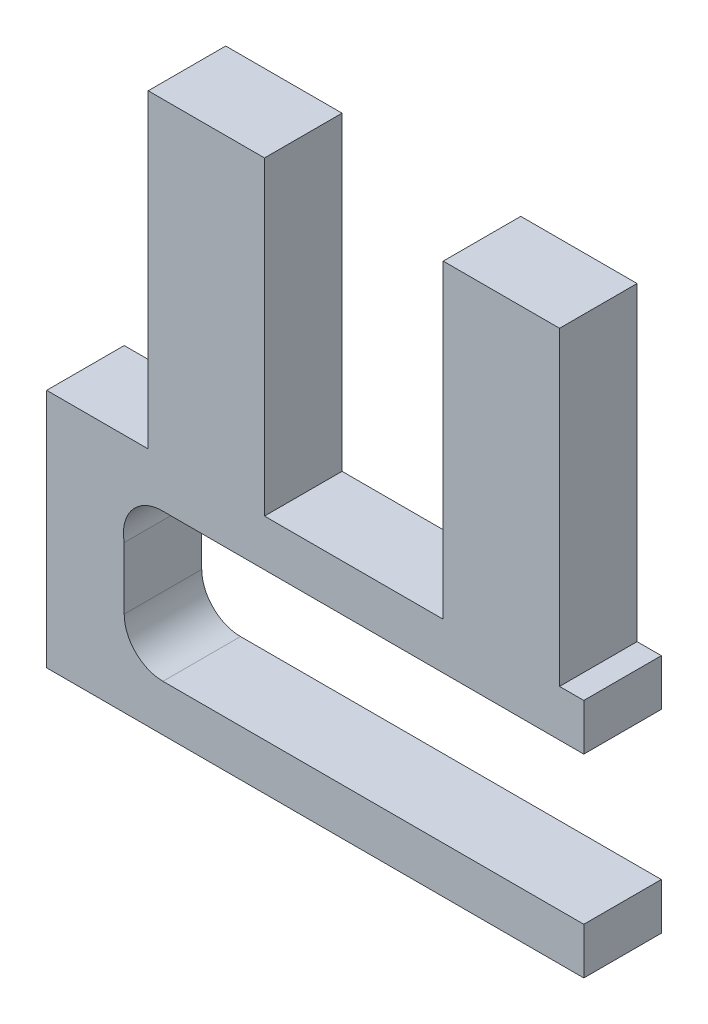
ISO-10303-21;
HEADER;
FILE_DESCRIPTION(('STEP AP214'),'2;1');
FILE_NAME('part.step','',(''),(''),'','','');
FILE_SCHEMA(('AUTOMOTIVE_DESIGN { 1 0 10303 214 1 1 1 1 }'));
ENDSEC;
DATA;
#1=APPLICATION_CONTEXT('core data for automotive mechanical design processes');
#2=APPLICATION_PROTOCOL_DEFINITION('international standard','automotive_design',2000,#1);
#3=PRODUCT_CONTEXT('',#1,'mechanical');
#4=PRODUCT('Part','Part','',(#3));
#5=PRODUCT_RELATED_PRODUCT_CATEGORY('part','',(#4));
#6=PRODUCT_DEFINITION_FORMATION('','',#4);
#7=PRODUCT_DEFINITION_CONTEXT('part definition',#1,'design');
#8=PRODUCT_DEFINITION('design','',#6,#7);
#9=PRODUCT_DEFINITION_SHAPE('','',#8);
#10=(LENGTH_UNIT() NAMED_UNIT(*) SI_UNIT(.MILLI.,.METRE.));
#11=(NAMED_UNIT(*) PLANE_ANGLE_UNIT() SI_UNIT($,.RADIAN.));
#12=(NAMED_UNIT(*) SI_UNIT($,.STERADIAN.) SOLID_ANGLE_UNIT());
#13=UNCERTAINTY_MEASURE_WITH_UNIT(LENGTH_MEASURE(1.E-05),#10,'distance_accuracy_value','');
#14=(GEOMETRIC_REPRESENTATION_CONTEXT(3) GLOBAL_UNCERTAINTY_ASSIGNED_CONTEXT((#13)) GLOBAL_UNIT_ASSIGNED_CONTEXT((#10,
#11,#12)) REPRESENTATION_CONTEXT('',''));
#15=CARTESIAN_POINT('',(0.,0.,0.));
#16=DIRECTION('',(0.,0.,1.));
#17=DIRECTION('',(1.,0.,0.));
#18=AXIS2_PLACEMENT_3D('',#15,#16,#17);
#19=CARTESIAN_POINT('',(0.,7.41885137661942,10.));
#20=DIRECTION('',(0.,1.,0.));
#21=DIRECTION('',(0.,0.,1.));
#22=AXIS2_PLACEMENT_3D('',#19,#20,#21);
#23=PLANE('',#22);
#24=DIRECTION('',(1.,0.,0.));
#25=VECTOR('',#24,1.);
#26=CARTESIAN_POINT('',(0.,7.41885137661942,0.));
#27=LINE('',#26,#25);
#28=CARTESIAN_POINT('',(7.45996937927725,7.41885137661942,0.));
#29=VERTEX_POINT('',#28);
#30=CARTESIAN_POINT('',(61.7300558201244,7.41885137661942,0.));
#31=VERTEX_POINT('',#30);
#32=EDGE_CURVE('E189',#29,#31,#27,.T.);
#33=ORIENTED_EDGE('',*,*,#32,.F.);
#34=DIRECTION('',(0.,0.,-1.));
#35=VECTOR('',#34,1.);
#36=CARTESIAN_POINT('',(7.45996937927725,7.41885137661942,10.));
#37=LINE('',#36,#35);
#38=CARTESIAN_POINT('',(7.45996937927725,7.41885137661942,10.));
#39=VERTEX_POINT('',#38);
#40=EDGE_CURVE('E11',#39,#29,#37,.T.);
#41=ORIENTED_EDGE('',*,*,#40,.F.);
#42=DIRECTION('',(1.,0.,0.));
#43=VECTOR('',#42,1.);
#44=CARTESIAN_POINT('',(0.,7.41885137661942,10.));
#45=LINE('',#44,#43);
#46=CARTESIAN_POINT('',(61.7300558201244,7.41885137661942,10.));
#47=VERTEX_POINT('',#46);
#48=EDGE_CURVE('E237',#39,#47,#45,.T.);
#49=ORIENTED_EDGE('',*,*,#48,.T.);
#50=DIRECTION('',(0.,0.,-1.));
#51=VECTOR('',#50,1.);
#52=CARTESIAN_POINT('',(61.7300558201244,7.41885137661942,10.));
#53=LINE('',#52,#51);
#54=EDGE_CURVE('E49',#47,#31,#53,.T.);
#55=ORIENTED_EDGE('',*,*,#54,.T.);
#56=EDGE_LOOP('',(#33,#41,#49,#55));
#57=FACE_BOUND('',#56,.T.);
#58=ADVANCED_FACE('F33',(#57),#23,.T.);
#59=CARTESIAN_POINT('',(7.45996937927725,12.4188513766194,10.));
#60=DIRECTION('',(0.,0.,-1.));
#61=DIRECTION('',(-1.,0.,0.));
#62=AXIS2_PLACEMENT_3D('',#59,#60,#61);
#63=CYLINDRICAL_SURFACE('',#62,5.);
#64=CARTESIAN_POINT('',(7.45996937927725,12.4188513766194,0.));
#65=DIRECTION('',(0.,0.,1.));
#66=DIRECTION('',(1.,0.,0.));
#67=AXIS2_PLACEMENT_3D('',#64,#65,#66);
#68=CIRCLE('',#67,5.);
#69=CARTESIAN_POINT('',(2.45996937927725,12.4188513766194,0.));
#70=VERTEX_POINT('',#69);
#71=EDGE_CURVE('E191',#29,#70,#68,.F.);
#72=ORIENTED_EDGE('',*,*,#71,.T.);
#73=DIRECTION('',(0.,0.,-1.));
#74=VECTOR('',#73,1.);
#75=CARTESIAN_POINT('',(2.45996937927725,12.4188513766194,10.));
#76=LINE('',#75,#74);
#77=CARTESIAN_POINT('',(2.45996937927725,12.4188513766194,10.));
#78=VERTEX_POINT('',#77);
#79=EDGE_CURVE('E41',#78,#70,#76,.T.);
#80=ORIENTED_EDGE('',*,*,#79,.F.);
#81=CARTESIAN_POINT('',(7.45996937927725,12.4188513766194,10.));
#82=DIRECTION('',(0.,0.,1.));
#83=DIRECTION('',(1.,0.,0.));
#84=AXIS2_PLACEMENT_3D('',#81,#82,#83);
#85=CIRCLE('',#84,5.);
#86=EDGE_CURVE('E286',#39,#78,#85,.F.);
#87=ORIENTED_EDGE('',*,*,#86,.F.);
#88=ORIENTED_EDGE('',*,*,#40,.T.);
#89=EDGE_LOOP('',(#72,#80,#87,#88));
#90=FACE_BOUND('',#89,.T.);
#91=ADVANCED_FACE('F275',(#90),#63,.F.);
#92=CARTESIAN_POINT('',(2.45996937927725,0.,10.));
#93=DIRECTION('',(1.,0.,0.));
#94=DIRECTION('',(0.,0.,-1.));
#95=AXIS2_PLACEMENT_3D('',#92,#93,#94);
#96=PLANE('',#95);
#97=DIRECTION('',(0.,-1.,0.));
#98=VECTOR('',#97,1.);
#99=CARTESIAN_POINT('',(2.45996937927725,0.,0.));
#100=LINE('',#99,#98);
#101=CARTESIAN_POINT('',(2.45996937927725,20.4188513766194,0.));
#102=VERTEX_POINT('',#101);
#103=EDGE_CURVE('E194',#102,#70,#100,.T.);
#104=ORIENTED_EDGE('',*,*,#103,.F.);
#105=DIRECTION('',(0.,0.,-1.));
#106=VECTOR('',#105,1.);
#107=CARTESIAN_POINT('',(2.45996937927725,20.4188513766194,10.));
#108=LINE('',#107,#106);
#109=CARTESIAN_POINT('',(2.45996937927725,20.4188513766194,10.));
#110=VERTEX_POINT('',#109);
#111=EDGE_CURVE('E265',#110,#102,#108,.T.);
#112=ORIENTED_EDGE('',*,*,#111,.F.);
#113=DIRECTION('',(0.,-1.,0.));
#114=VECTOR('',#113,1.);
#115=CARTESIAN_POINT('',(2.45996937927725,0.,10.));
#116=LINE('',#115,#114);
#117=EDGE_CURVE('E272',#110,#78,#116,.T.);
#118=ORIENTED_EDGE('',*,*,#117,.T.);
#119=ORIENTED_EDGE('',*,*,#79,.T.);
#120=EDGE_LOOP('',(#104,#112,#118,#119));
#121=FACE_BOUND('',#120,.T.);
#122=ADVANCED_FACE('F270',(#121),#96,.T.);
#123=CARTESIAN_POINT('',(7.3587395559836,21.4198762293641,10.));
#124=DIRECTION('',(0.,0.,-1.));
#125=DIRECTION('',(-1.,0.,0.));
#126=AXIS2_PLACEMENT_3D('',#123,#124,#125);
#127=CYLINDRICAL_SURFACE('',#126,5.00000000000001);
#128=CARTESIAN_POINT('',(7.3587395559836,21.4198762293641,0.));
#129=DIRECTION('',(0.,0.,1.));
#130=DIRECTION('',(1.,0.,0.));
#131=AXIS2_PLACEMENT_3D('',#128,#129,#130);
#132=CIRCLE('',#131,5.00000000000001);
#133=CARTESIAN_POINT('',(7.45996937927701,26.4188513766194,0.));
#134=VERTEX_POINT('',#133);
#135=EDGE_CURVE('E197',#134,#102,#132,.T.);
#136=ORIENTED_EDGE('',*,*,#135,.F.);
#137=DIRECTION('',(0.,0.,-1.));
#138=VECTOR('',#137,1.);
#139=CARTESIAN_POINT('',(7.45996937927701,26.4188513766194,10.));
#140=LINE('',#139,#138);
#141=CARTESIAN_POINT('',(7.45996937927701,26.4188513766194,10.));
#142=VERTEX_POINT('',#141);
#143=EDGE_CURVE('E263',#142,#134,#140,.T.);
#144=ORIENTED_EDGE('',*,*,#143,.F.);
#145=CARTESIAN_POINT('',(7.3587395559836,21.4198762293641,10.));
#146=DIRECTION('',(0.,0.,1.));
#147=DIRECTION('',(1.,0.,0.));
#148=AXIS2_PLACEMENT_3D('',#145,#146,#147);
#149=CIRCLE('',#148,5.00000000000001);
#150=EDGE_CURVE('E285',#142,#110,#149,.T.);
#151=ORIENTED_EDGE('',*,*,#150,.T.);
#152=ORIENTED_EDGE('',*,*,#111,.T.);
#153=EDGE_LOOP('',(#136,#144,#151,#152));
#154=FACE_BOUND('',#153,.T.);
#155=ADVANCED_FACE('F281',(#154),#127,.F.);
#156=CARTESIAN_POINT('',(0.,26.4188513766194,10.));
#157=DIRECTION('',(0.,1.,0.));
#158=DIRECTION('',(-1.,0.,0.));
#159=AXIS2_PLACEMENT_3D('',#156,#157,#158);
#160=PLANE('',#159);
#161=DIRECTION('',(1.,0.,0.));
#162=VECTOR('',#161,1.);
#163=CARTESIAN_POINT('',(0.,26.4188513766194,0.));
#164=LINE('',#163,#162);
#165=CARTESIAN_POINT('',(61.7300558201244,26.4188513766194,0.));
#166=VERTEX_POINT('',#165);
#167=EDGE_CURVE('E200',#134,#166,#164,.T.);
#168=ORIENTED_EDGE('',*,*,#167,.T.);
#169=DIRECTION('',(0.,0.,-1.));
#170=VECTOR('',#169,1.);
#171=CARTESIAN_POINT('',(61.7300558201244,26.4188513766194,10.));
#172=LINE('',#171,#170);
#173=CARTESIAN_POINT('',(61.7300558201244,26.4188513766194,10.));
#174=VERTEX_POINT('',#173);
#175=EDGE_CURVE('E261',#174,#166,#172,.T.);
#176=ORIENTED_EDGE('',*,*,#175,.F.);
#177=DIRECTION('',(1.,0.,0.));
#178=VECTOR('',#177,1.);
#179=CARTESIAN_POINT('',(0.,26.4188513766194,10.));
#180=LINE('',#179,#178);
#181=EDGE_CURVE('E288',#142,#174,#180,.T.);
#182=ORIENTED_EDGE('',*,*,#181,.F.);
#183=ORIENTED_EDGE('',*,*,#143,.T.);
#184=EDGE_LOOP('',(#168,#176,#182,#183));
#185=FACE_BOUND('',#184,.T.);
#186=ADVANCED_FACE('F343',(#185),#160,.F.);
#187=CARTESIAN_POINT('',(61.7300558201244,0.,10.));
#188=DIRECTION('',(1.,0.,0.));
#189=DIRECTION('',(0.,0.,-1.));
#190=AXIS2_PLACEMENT_3D('',#187,#188,#189);
#191=PLANE('',#190);
#192=DIRECTION('',(0.,-1.,0.));
#193=VECTOR('',#192,1.);
#194=CARTESIAN_POINT('',(61.7300558201244,0.,0.));
#195=LINE('',#194,#193);
#196=CARTESIAN_POINT('',(61.7300558201244,32.4188513766194,0.));
#197=VERTEX_POINT('',#196);
#198=EDGE_CURVE('E203',#197,#166,#195,.T.);
#199=ORIENTED_EDGE('',*,*,#198,.F.);
#200=DIRECTION('',(0.,0.,-1.));
#201=VECTOR('',#200,1.);
#202=CARTESIAN_POINT('',(61.7300558201244,32.4188513766194,10.));
#203=LINE('',#202,#201);
#204=CARTESIAN_POINT('',(61.7300558201244,32.4188513766194,10.));
#205=VERTEX_POINT('',#204);
#206=EDGE_CURVE('E259',#205,#197,#203,.T.);
#207=ORIENTED_EDGE('',*,*,#206,.F.);
#208=DIRECTION('',(0.,-1.,0.));
#209=VECTOR('',#208,1.);
#210=CARTESIAN_POINT('',(61.7300558201244,0.,10.));
#211=LINE('',#210,#209);
#212=EDGE_CURVE('E294',#205,#174,#211,.T.);
#213=ORIENTED_EDGE('',*,*,#212,.T.);
#214=ORIENTED_EDGE('',*,*,#175,.T.);
#215=EDGE_LOOP('',(#199,#207,#213,#214));
#216=FACE_BOUND('',#215,.T.);
#217=ADVANCED_FACE('F346',(#216),#191,.T.);
#218=CARTESIAN_POINT('',(0.,32.4188513766194,10.));
#219=DIRECTION('',(0.,1.,0.));
#220=DIRECTION('',(0.,0.,1.));
#221=AXIS2_PLACEMENT_3D('',#218,#219,#220);
#222=PLANE('',#221);
#223=DIRECTION('',(1.,0.,0.));
#224=VECTOR('',#223,1.);
#225=CARTESIAN_POINT('',(0.,32.4188513766194,0.));
#226=LINE('',#225,#224);
#227=CARTESIAN_POINT('',(58.6011949903506,32.4188513766194,0.));
#228=VERTEX_POINT('',#227);
#229=EDGE_CURVE('E206',#228,#197,#226,.T.);
#230=ORIENTED_EDGE('',*,*,#229,.F.);
#231=DIRECTION('',(0.,0.,-1.));
#232=VECTOR('',#231,1.);
#233=CARTESIAN_POINT('',(58.6011949903506,32.4188513766194,10.));
#234=LINE('',#233,#232);
#235=CARTESIAN_POINT('',(58.6011949903506,32.4188513766194,10.));
#236=VERTEX_POINT('',#235);
#237=EDGE_CURVE('E257',#236,#228,#234,.T.);
#238=ORIENTED_EDGE('',*,*,#237,.F.);
#239=DIRECTION('',(1.,0.,0.));
#240=VECTOR('',#239,1.);
#241=CARTESIAN_POINT('',(0.,32.4188513766194,10.));
#242=LINE('',#241,#240);
#243=EDGE_CURVE('E297',#236,#205,#242,.T.);
#244=ORIENTED_EDGE('',*,*,#243,.T.);
#245=ORIENTED_EDGE('',*,*,#206,.T.);
#246=EDGE_LOOP('',(#230,#238,#244,#245));
#247=FACE_BOUND('',#246,.T.);
#248=ADVANCED_FACE('F350',(#247),#222,.T.);
#249=CARTESIAN_POINT('',(58.6011949903506,0.,10.));
#250=DIRECTION('',(-1.,0.,0.));
#251=DIRECTION('',(0.,0.,1.));
#252=AXIS2_PLACEMENT_3D('',#249,#250,#251);
#253=PLANE('',#252);
#254=DIRECTION('',(0.,1.,0.));
#255=VECTOR('',#254,1.);
#256=CARTESIAN_POINT('',(58.6011949903506,0.,0.));
#257=LINE('',#256,#255);
#258=CARTESIAN_POINT('',(58.6011949903506,72.4188513766194,0.));
#259=VERTEX_POINT('',#258);
#260=EDGE_CURVE('E209',#228,#259,#257,.T.);
#261=ORIENTED_EDGE('',*,*,#260,.T.);
#262=DIRECTION('',(0.,0.,-1.));
#263=VECTOR('',#262,1.);
#264=CARTESIAN_POINT('',(58.6011949903506,72.4188513766194,10.));
#265=LINE('',#264,#263);
#266=CARTESIAN_POINT('',(58.6011949903506,72.4188513766194,10.));
#267=VERTEX_POINT('',#266);
#268=EDGE_CURVE('E254',#267,#259,#265,.T.);
#269=ORIENTED_EDGE('',*,*,#268,.F.);
#270=DIRECTION('',(0.,1.,0.));
#271=VECTOR('',#270,1.);
#272=CARTESIAN_POINT('',(58.6011949903506,0.,10.));
#273=LINE('',#272,#271);
#274=EDGE_CURVE('E300',#236,#267,#273,.T.);
#275=ORIENTED_EDGE('',*,*,#274,.F.);
#276=ORIENTED_EDGE('',*,*,#237,.T.);
#277=EDGE_LOOP('',(#261,#269,#275,#276));
#278=FACE_BOUND('',#277,.T.);
#279=ADVANCED_FACE('F354',(#278),#253,.F.);
#280=CARTESIAN_POINT('',(0.,72.4188513766194,10.));
#281=DIRECTION('',(0.,-1.,0.));
#282=DIRECTION('',(0.,0.,-1.));
#283=AXIS2_PLACEMENT_3D('',#280,#281,#282);
#284=PLANE('',#283);
#285=DIRECTION('',(-1.,0.,0.));
#286=VECTOR('',#285,1.);
#287=CARTESIAN_POINT('',(0.,72.4188513766194,0.));
#288=LINE('',#287,#286);
#289=CARTESIAN_POINT('',(43.6011949903506,72.4188513766194,0.));
#290=VERTEX_POINT('',#289);
#291=EDGE_CURVE('E211',#259,#290,#288,.T.);
#292=ORIENTED_EDGE('',*,*,#291,.T.);
#293=DIRECTION('',(0.,0.,-1.));
#294=VECTOR('',#293,1.);
#295=CARTESIAN_POINT('',(43.6011949903506,72.4188513766194,10.));
#296=LINE('',#295,#294);
#297=CARTESIAN_POINT('',(43.6011949903506,72.4188513766194,10.));
#298=VERTEX_POINT('',#297);
#299=EDGE_CURVE('E252',#298,#290,#296,.T.);
#300=ORIENTED_EDGE('',*,*,#299,.F.);
#301=DIRECTION('',(-1.,0.,0.));
#302=VECTOR('',#301,1.);
#303=CARTESIAN_POINT('',(0.,72.4188513766194,10.));
#304=LINE('',#303,#302);
#305=EDGE_CURVE('E302',#267,#298,#304,.T.);
#306=ORIENTED_EDGE('',*,*,#305,.F.);
#307=ORIENTED_EDGE('',*,*,#268,.T.);
#308=EDGE_LOOP('',(#292,#300,#306,#307));
#309=FACE_BOUND('',#308,.T.);
#310=ADVANCED_FACE('F358',(#309),#284,.F.);
#311=CARTESIAN_POINT('',(43.6011949903506,0.,10.));
#312=DIRECTION('',(-1.,0.,0.));
#313=DIRECTION('',(0.,0.,1.));
#314=AXIS2_PLACEMENT_3D('',#311,#312,#313);
#315=PLANE('',#314);
#316=DIRECTION('',(0.,1.,0.));
#317=VECTOR('',#316,1.);
#318=CARTESIAN_POINT('',(43.6011949903506,0.,0.));
#319=LINE('',#318,#317);
#320=CARTESIAN_POINT('',(43.6011949903506,32.4188513766194,0.));
#321=VERTEX_POINT('',#320);
#322=EDGE_CURVE('E214',#321,#290,#319,.T.);
#323=ORIENTED_EDGE('',*,*,#322,.F.);
#324=DIRECTION('',(0.,0.,-1.));
#325=VECTOR('',#324,1.);
#326=CARTESIAN_POINT('',(43.6011949903506,32.4188513766194,10.));
#327=LINE('',#326,#325);
#328=CARTESIAN_POINT('',(43.6011949903506,32.4188513766194,10.));
#329=VERTEX_POINT('',#328);
#330=EDGE_CURVE('E250',#329,#321,#327,.T.);
#331=ORIENTED_EDGE('',*,*,#330,.F.);
#332=DIRECTION('',(0.,1.,0.));
#333=VECTOR('',#332,1.);
#334=CARTESIAN_POINT('',(43.6011949903506,0.,10.));
#335=LINE('',#334,#333);
#336=EDGE_CURVE('E304',#329,#298,#335,.T.);
#337=ORIENTED_EDGE('',*,*,#336,.T.);
#338=ORIENTED_EDGE('',*,*,#299,.T.);
#339=EDGE_LOOP('',(#323,#331,#337,#338));
#340=FACE_BOUND('',#339,.T.);
#341=ADVANCED_FACE('F362',(#340),#315,.T.);
#342=CARTESIAN_POINT('',(0.,32.4188513766194,10.));
#343=DIRECTION('',(0.,1.,0.));
#344=DIRECTION('',(0.,0.,1.));
#345=AXIS2_PLACEMENT_3D('',#342,#343,#344);
#346=PLANE('',#345);
#347=DIRECTION('',(1.,0.,0.));
#348=VECTOR('',#347,1.);
#349=CARTESIAN_POINT('',(0.,32.4188513766194,0.));
#350=LINE('',#349,#348);
#351=CARTESIAN_POINT('',(20.5532080450363,32.4188513766194,0.));
#352=VERTEX_POINT('',#351);
#353=EDGE_CURVE('E217',#352,#321,#350,.T.);
#354=ORIENTED_EDGE('',*,*,#353,.F.);
#355=DIRECTION('',(0.,0.,-1.));
#356=VECTOR('',#355,1.);
#357=CARTESIAN_POINT('',(20.5532080450363,32.4188513766194,10.));
#358=LINE('',#357,#356);
#359=CARTESIAN_POINT('',(20.5532080450363,32.4188513766194,10.));
#360=VERTEX_POINT('',#359);
#361=EDGE_CURVE('E248',#360,#352,#358,.T.);
#362=ORIENTED_EDGE('',*,*,#361,.F.);
#363=DIRECTION('',(1.,0.,0.));
#364=VECTOR('',#363,1.);
#365=CARTESIAN_POINT('',(0.,32.4188513766194,10.));
#366=LINE('',#365,#364);
#367=EDGE_CURVE('E307',#360,#329,#366,.T.);
#368=ORIENTED_EDGE('',*,*,#367,.T.);
#369=ORIENTED_EDGE('',*,*,#330,.T.);
#370=EDGE_LOOP('',(#354,#362,#368,#369));
#371=FACE_BOUND('',#370,.T.);
#372=ADVANCED_FACE('F366',(#371),#346,.T.);
#373=CARTESIAN_POINT('',(20.5532080450363,0.,10.));
#374=DIRECTION('',(-1.,0.,0.));
#375=DIRECTION('',(0.,0.,1.));
#376=AXIS2_PLACEMENT_3D('',#373,#374,#375);
#377=PLANE('',#376);
#378=DIRECTION('',(0.,1.,0.));
#379=VECTOR('',#378,1.);
#380=CARTESIAN_POINT('',(20.5532080450363,0.,0.));
#381=LINE('',#380,#379);
#382=CARTESIAN_POINT('',(20.5532080450363,72.4188513766194,0.));
#383=VERTEX_POINT('',#382);
#384=EDGE_CURVE('E220',#352,#383,#381,.T.);
#385=ORIENTED_EDGE('',*,*,#384,.T.);
#386=DIRECTION('',(0.,0.,-1.));
#387=VECTOR('',#386,1.);
#388=CARTESIAN_POINT('',(20.5532080450363,72.4188513766194,10.));
#389=LINE('',#388,#387);
#390=CARTESIAN_POINT('',(20.5532080450363,72.4188513766194,10.));
#391=VERTEX_POINT('',#390);
#392=EDGE_CURVE('E245',#391,#383,#389,.T.);
#393=ORIENTED_EDGE('',*,*,#392,.F.);
#394=DIRECTION('',(0.,1.,0.));
#395=VECTOR('',#394,1.);
#396=CARTESIAN_POINT('',(20.5532080450363,0.,10.));
#397=LINE('',#396,#395);
#398=EDGE_CURVE('E310',#360,#391,#397,.T.);
#399=ORIENTED_EDGE('',*,*,#398,.F.);
#400=ORIENTED_EDGE('',*,*,#361,.T.);
#401=EDGE_LOOP('',(#385,#393,#399,#400));
#402=FACE_BOUND('',#401,.T.);
#403=ADVANCED_FACE('F370',(#402),#377,.F.);
#404=CARTESIAN_POINT('',(0.,72.4188513766194,10.));
#405=DIRECTION('',(0.,-1.,0.));
#406=DIRECTION('',(0.,0.,-1.));
#407=AXIS2_PLACEMENT_3D('',#404,#405,#406);
#408=PLANE('',#407);
#409=DIRECTION('',(-1.,0.,0.));
#410=VECTOR('',#409,1.);
#411=CARTESIAN_POINT('',(0.,72.4188513766194,0.));
#412=LINE('',#411,#410);
#413=CARTESIAN_POINT('',(5.55320804503627,72.4188513766194,0.));
#414=VERTEX_POINT('',#413);
#415=EDGE_CURVE('E222',#383,#414,#412,.T.);
#416=ORIENTED_EDGE('',*,*,#415,.T.);
#417=DIRECTION('',(0.,0.,-1.));
#418=VECTOR('',#417,1.);
#419=CARTESIAN_POINT('',(5.55320804503627,72.4188513766194,10.));
#420=LINE('',#419,#418);
#421=CARTESIAN_POINT('',(5.55320804503627,72.4188513766194,10.));
#422=VERTEX_POINT('',#421);
#423=EDGE_CURVE('E243',#422,#414,#420,.T.);
#424=ORIENTED_EDGE('',*,*,#423,.F.);
#425=DIRECTION('',(-1.,0.,0.));
#426=VECTOR('',#425,1.);
#427=CARTESIAN_POINT('',(0.,72.4188513766194,10.));
#428=LINE('',#427,#426);
#429=EDGE_CURVE('E312',#391,#422,#428,.T.);
#430=ORIENTED_EDGE('',*,*,#429,.F.);
#431=ORIENTED_EDGE('',*,*,#392,.T.);
#432=EDGE_LOOP('',(#416,#424,#430,#431));
#433=FACE_BOUND('',#432,.T.);
#434=ADVANCED_FACE('F374',(#433),#408,.F.);
#435=CARTESIAN_POINT('',(5.55320804503627,0.,10.));
#436=DIRECTION('',(-1.,0.,0.));
#437=DIRECTION('',(0.,0.,1.));
#438=AXIS2_PLACEMENT_3D('',#435,#436,#437);
#439=PLANE('',#438);
#440=DIRECTION('',(0.,1.,0.));
#441=VECTOR('',#440,1.);
#442=CARTESIAN_POINT('',(5.55320804503627,0.,0.));
#443=LINE('',#442,#441);
#444=CARTESIAN_POINT('',(5.55320804503627,32.4188513766194,0.));
#445=VERTEX_POINT('',#444);
#446=EDGE_CURVE('E225',#445,#414,#443,.T.);
#447=ORIENTED_EDGE('',*,*,#446,.F.);
#448=DIRECTION('',(0.,0.,-1.));
#449=VECTOR('',#448,1.);
#450=CARTESIAN_POINT('',(5.55320804503627,32.4188513766194,10.));
#451=LINE('',#450,#449);
#452=CARTESIAN_POINT('',(5.55320804503627,32.4188513766194,10.));
#453=VERTEX_POINT('',#452);
#454=EDGE_CURVE('E241',#453,#445,#451,.T.);
#455=ORIENTED_EDGE('',*,*,#454,.F.);
#456=DIRECTION('',(0.,1.,0.));
#457=VECTOR('',#456,1.);
#458=CARTESIAN_POINT('',(5.55320804503627,0.,10.));
#459=LINE('',#458,#457);
#460=EDGE_CURVE('E184',#453,#422,#459,.T.);
#461=ORIENTED_EDGE('',*,*,#460,.T.);
#462=ORIENTED_EDGE('',*,*,#423,.T.);
#463=EDGE_LOOP('',(#447,#455,#461,#462));
#464=FACE_BOUND('',#463,.T.);
#465=ADVANCED_FACE('F316',(#464),#439,.T.);
#466=CARTESIAN_POINT('',(0.,32.4188513766194,10.));
#467=DIRECTION('',(0.,1.,0.));
#468=DIRECTION('',(0.,0.,1.));
#469=AXIS2_PLACEMENT_3D('',#466,#467,#468);
#470=PLANE('',#469);
#471=DIRECTION('',(1.,0.,0.));
#472=VECTOR('',#471,1.);
#473=CARTESIAN_POINT('',(0.,32.4188513766194,0.));
#474=LINE('',#473,#472);
#475=CARTESIAN_POINT('',(-7.54003062072275,32.4188513766194,0.));
#476=VERTEX_POINT('',#475);
#477=EDGE_CURVE('E228',#476,#445,#474,.T.);
#478=ORIENTED_EDGE('',*,*,#477,.F.);
#479=DIRECTION('',(0.,0.,-1.));
#480=VECTOR('',#479,1.);
#481=CARTESIAN_POINT('',(-7.54003062072275,32.4188513766194,10.));
#482=LINE('',#481,#480);
#483=CARTESIAN_POINT('',(-7.54003062072275,32.4188513766194,10.));
#484=VERTEX_POINT('',#483);
#485=EDGE_CURVE('E169',#484,#476,#482,.T.);
#486=ORIENTED_EDGE('',*,*,#485,.F.);
#487=DIRECTION('',(1.,0.,0.));
#488=VECTOR('',#487,1.);
#489=CARTESIAN_POINT('',(0.,32.4188513766194,10.));
#490=LINE('',#489,#488);
#491=EDGE_CURVE('E182',#484,#453,#490,.T.);
#492=ORIENTED_EDGE('',*,*,#491,.T.);
#493=ORIENTED_EDGE('',*,*,#454,.T.);
#494=EDGE_LOOP('',(#478,#486,#492,#493));
#495=FACE_BOUND('',#494,.T.);
#496=ADVANCED_FACE('F321',(#495),#470,.T.);
#497=CARTESIAN_POINT('',(-7.54003062072275,0.,10.));
#498=DIRECTION('',(-1.,0.,0.));
#499=DIRECTION('',(0.,0.,1.));
#500=AXIS2_PLACEMENT_3D('',#497,#498,#499);
#501=PLANE('',#500);
#502=DIRECTION('',(0.,1.,0.));
#503=VECTOR('',#502,1.);
#504=CARTESIAN_POINT('',(-7.54003062072275,0.,0.));
#505=LINE('',#504,#503);
#506=CARTESIAN_POINT('',(-7.54003062072275,1.41885137661942,0.));
#507=VERTEX_POINT('',#506);
#508=EDGE_CURVE('E166',#507,#476,#505,.T.);
#509=ORIENTED_EDGE('',*,*,#508,.F.);
#510=DIRECTION('',(0.,0.,-1.));
#511=VECTOR('',#510,1.);
#512=CARTESIAN_POINT('',(-7.54003062072275,1.41885137661942,10.));
#513=LINE('',#512,#511);
#514=CARTESIAN_POINT('',(-7.54003062072275,1.41885137661942,10.));
#515=VERTEX_POINT('',#514);
#516=EDGE_CURVE('E160',#515,#507,#513,.T.);
#517=ORIENTED_EDGE('',*,*,#516,.F.);
#518=DIRECTION('',(0.,1.,0.));
#519=VECTOR('',#518,1.);
#520=CARTESIAN_POINT('',(-7.54003062072275,0.,10.));
#521=LINE('',#520,#519);
#522=EDGE_CURVE('E164',#515,#484,#521,.T.);
#523=ORIENTED_EDGE('',*,*,#522,.T.);
#524=ORIENTED_EDGE('',*,*,#485,.T.);
#525=EDGE_LOOP('',(#509,#517,#523,#524));
#526=FACE_BOUND('',#525,.T.);
#527=ADVANCED_FACE('F162',(#526),#501,.T.);
#528=CARTESIAN_POINT('',(0.,1.41885137661942,10.));
#529=DIRECTION('',(0.,1.,0.));
#530=DIRECTION('',(0.,0.,1.));
#531=AXIS2_PLACEMENT_3D('',#528,#529,#530);
#532=PLANE('',#531);
#533=DIRECTION('',(1.,0.,0.));
#534=VECTOR('',#533,1.);
#535=CARTESIAN_POINT('',(0.,1.41885137661942,0.));
#536=LINE('',#535,#534);
#537=CARTESIAN_POINT('',(61.7300558201244,1.41885137661942,0.));
#538=VERTEX_POINT('',#537);
#539=EDGE_CURVE('E232',#507,#538,#536,.T.);
#540=ORIENTED_EDGE('',*,*,#539,.T.);
#541=DIRECTION('',(0.,0.,-1.));
#542=VECTOR('',#541,1.);
#543=CARTESIAN_POINT('',(61.7300558201244,1.41885137661942,10.));
#544=LINE('',#543,#542);
#545=CARTESIAN_POINT('',(61.7300558201244,1.41885137661942,10.));
#546=VERTEX_POINT('',#545);
#547=EDGE_CURVE('E105',#546,#538,#544,.T.);
#548=ORIENTED_EDGE('',*,*,#547,.F.);
#549=DIRECTION('',(1.,0.,0.));
#550=VECTOR('',#549,1.);
#551=CARTESIAN_POINT('',(0.,1.41885137661942,10.));
#552=LINE('',#551,#550);
#553=EDGE_CURVE('E171',#515,#546,#552,.T.);
#554=ORIENTED_EDGE('',*,*,#553,.F.);
#555=ORIENTED_EDGE('',*,*,#516,.T.);
#556=EDGE_LOOP('',(#540,#548,#554,#555));
#557=FACE_BOUND('',#556,.T.);
#558=ADVANCED_FACE('F172',(#557),#532,.F.);
#559=CARTESIAN_POINT('',(61.7300558201244,0.,10.));
#560=DIRECTION('',(1.,0.,0.));
#561=DIRECTION('',(0.,0.,-1.));
#562=AXIS2_PLACEMENT_3D('',#559,#560,#561);
#563=PLANE('',#562);
#564=DIRECTION('',(0.,-1.,0.));
#565=VECTOR('',#564,1.);
#566=CARTESIAN_POINT('',(61.7300558201244,0.,0.));
#567=LINE('',#566,#565);
#568=EDGE_CURVE('E234',#31,#538,#567,.T.);
#569=ORIENTED_EDGE('',*,*,#568,.F.);
#570=ORIENTED_EDGE('',*,*,#54,.F.);
#571=DIRECTION('',(0.,-1.,0.));
#572=VECTOR('',#571,1.);
#573=CARTESIAN_POINT('',(61.7300558201244,0.,10.));
#574=LINE('',#573,#572);
#575=EDGE_CURVE('E175',#47,#546,#574,.T.);
#576=ORIENTED_EDGE('',*,*,#575,.T.);
#577=ORIENTED_EDGE('',*,*,#547,.T.);
#578=EDGE_LOOP('',(#569,#570,#576,#577));
#579=FACE_BOUND('',#578,.T.);
#580=ADVANCED_FACE('F322',(#579),#563,.T.);
#581=CARTESIAN_POINT('',(0.,0.,10.));
#582=DIRECTION('',(0.,0.,1.));
#583=DIRECTION('',(1.,0.,0.));
#584=AXIS2_PLACEMENT_3D('',#581,#582,#583);
#585=PLANE('',#584);
#586=ORIENTED_EDGE('',*,*,#48,.F.);
#587=ORIENTED_EDGE('',*,*,#86,.T.);
#588=ORIENTED_EDGE('',*,*,#117,.F.);
#589=ORIENTED_EDGE('',*,*,#150,.F.);
#590=ORIENTED_EDGE('',*,*,#181,.T.);
#591=ORIENTED_EDGE('',*,*,#212,.F.);
#592=ORIENTED_EDGE('',*,*,#243,.F.);
#593=ORIENTED_EDGE('',*,*,#274,.T.);
#594=ORIENTED_EDGE('',*,*,#305,.T.);
#595=ORIENTED_EDGE('',*,*,#336,.F.);
#596=ORIENTED_EDGE('',*,*,#367,.F.);
#597=ORIENTED_EDGE('',*,*,#398,.T.);
#598=ORIENTED_EDGE('',*,*,#429,.T.);
#599=ORIENTED_EDGE('',*,*,#460,.F.);
#600=ORIENTED_EDGE('',*,*,#491,.F.);
#601=ORIENTED_EDGE('',*,*,#522,.F.);
#602=ORIENTED_EDGE('',*,*,#553,.T.);
#603=ORIENTED_EDGE('',*,*,#575,.F.);
#604=EDGE_LOOP('',(#586,#587,#588,#589,#590,#591,#592,#593,#594,#595,#596,#597,#598,#599,#600,
#601,#602,#603));
#605=FACE_BOUND('',#604,.T.);
#606=ADVANCED_FACE('F179',(#605),#585,.T.);
#607=CARTESIAN_POINT('',(0.,0.,0.));
#608=DIRECTION('',(0.,0.,1.));
#609=DIRECTION('',(1.,0.,0.));
#610=AXIS2_PLACEMENT_3D('',#607,#608,#609);
#611=PLANE('',#610);
#612=ORIENTED_EDGE('',*,*,#32,.T.);
#613=ORIENTED_EDGE('',*,*,#568,.T.);
#614=ORIENTED_EDGE('',*,*,#539,.F.);
#615=ORIENTED_EDGE('',*,*,#508,.T.);
#616=ORIENTED_EDGE('',*,*,#477,.T.);
#617=ORIENTED_EDGE('',*,*,#446,.T.);
#618=ORIENTED_EDGE('',*,*,#415,.F.);
#619=ORIENTED_EDGE('',*,*,#384,.F.);
#620=ORIENTED_EDGE('',*,*,#353,.T.);
#621=ORIENTED_EDGE('',*,*,#322,.T.);
#622=ORIENTED_EDGE('',*,*,#291,.F.);
#623=ORIENTED_EDGE('',*,*,#260,.F.);
#624=ORIENTED_EDGE('',*,*,#229,.T.);
#625=ORIENTED_EDGE('',*,*,#198,.T.);
#626=ORIENTED_EDGE('',*,*,#167,.F.);
#627=ORIENTED_EDGE('',*,*,#135,.T.);
#628=ORIENTED_EDGE('',*,*,#103,.T.);
#629=ORIENTED_EDGE('',*,*,#71,.F.);
#630=EDGE_LOOP('',(#612,#613,#614,#615,#616,#617,#618,#619,#620,#621,#622,#623,#624,#625,#626,
#627,#628,#629));
#631=FACE_BOUND('',#630,.T.);
#632=ADVANCED_FACE('F277',(#631),#611,.F.);
#633=CLOSED_SHELL('',(#58,#91,#122,#155,#186,#217,#248,#279,#310,#341,#372,#403,#434,#465,#496,
#527,#558,#580,#606,#632));
#634=MANIFOLD_SOLID_BREP('B2',#633);
#635=ADVANCED_BREP_SHAPE_REPRESENTATION('',(#18,#634),#14);
#636=SHAPE_DEFINITION_REPRESENTATION(#9,#635);
ENDSEC;
END-ISO-10303-21;
